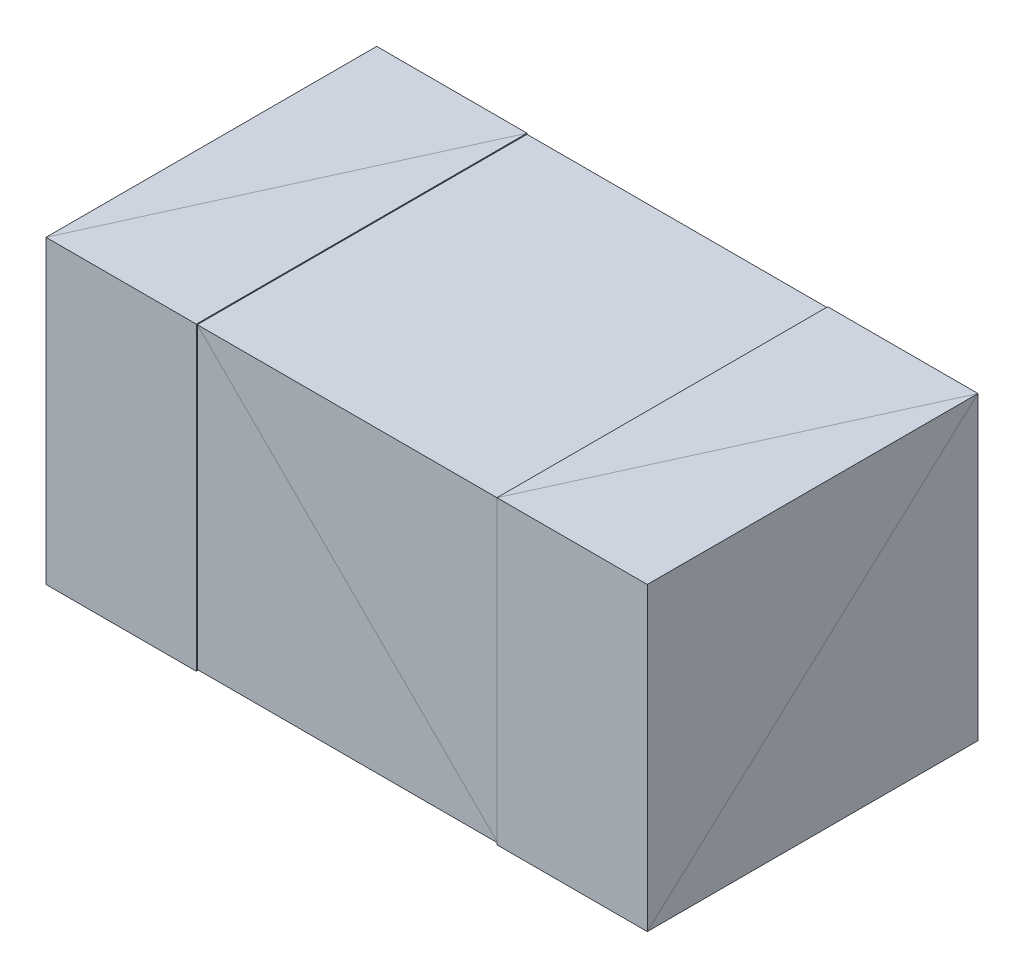
ISO-10303-21;
HEADER;
FILE_DESCRIPTION(('STEP AP214'),'2;1');
FILE_NAME('part.step','',(''),(''),'','','');
FILE_SCHEMA(('AUTOMOTIVE_DESIGN { 1 0 10303 214 1 1 1 1 }'));
ENDSEC;
DATA;
#1=APPLICATION_CONTEXT('core data for automotive mechanical design processes');
#2=APPLICATION_PROTOCOL_DEFINITION('international standard','automotive_design',2000,#1);
#3=PRODUCT_CONTEXT('',#1,'mechanical');
#4=PRODUCT('Part','Part','',(#3));
#5=PRODUCT_RELATED_PRODUCT_CATEGORY('part','',(#4));
#6=PRODUCT_DEFINITION_FORMATION('','',#4);
#7=PRODUCT_DEFINITION_CONTEXT('part definition',#1,'design');
#8=PRODUCT_DEFINITION('design','',#6,#7);
#9=PRODUCT_DEFINITION_SHAPE('','',#8);
#10=(LENGTH_UNIT() NAMED_UNIT(*) SI_UNIT(.MILLI.,.METRE.));
#11=(NAMED_UNIT(*) PLANE_ANGLE_UNIT() SI_UNIT($,.RADIAN.));
#12=(NAMED_UNIT(*) SI_UNIT($,.STERADIAN.) SOLID_ANGLE_UNIT());
#13=UNCERTAINTY_MEASURE_WITH_UNIT(LENGTH_MEASURE(1.E-05),#10,'distance_accuracy_value','');
#14=(GEOMETRIC_REPRESENTATION_CONTEXT(3) GLOBAL_UNCERTAINTY_ASSIGNED_CONTEXT((#13)) GLOBAL_UNIT_ASSIGNED_CONTEXT((#10,
#11,#12)) REPRESENTATION_CONTEXT('',''));
#15=CARTESIAN_POINT('',(0.,0.,0.));
#16=DIRECTION('',(0.,0.,1.));
#17=DIRECTION('',(1.,0.,0.));
#18=AXIS2_PLACEMENT_3D('',#15,#16,#17);
#19=CARTESIAN_POINT('',(0.,0.,0.33));
#20=DIRECTION('',(0.,0.,1.));
#21=DIRECTION('',(1.,0.,0.));
#22=AXIS2_PLACEMENT_3D('',#19,#20,#21);
#23=PLANE('',#22);
#24=DIRECTION('',(1.,0.,0.));
#25=VECTOR('',#24,1.);
#26=CARTESIAN_POINT('',(-0.3,-0.15,0.33));
#27=LINE('',#26,#25);
#28=CARTESIAN_POINT('',(-0.3,-0.15,0.33));
#29=VERTEX_POINT('',#28);
#30=CARTESIAN_POINT('',(-0.15,-0.15,0.33));
#31=VERTEX_POINT('',#30);
#32=EDGE_CURVE('P0_E11',#29,#31,#27,.T.);
#33=ORIENTED_EDGE('',*,*,#32,.T.);
#34=DIRECTION('',(0.,1.,0.));
#35=VECTOR('',#34,1.);
#36=CARTESIAN_POINT('',(-0.15,0.15,0.33));
#37=LINE('',#36,#35);
#38=CARTESIAN_POINT('',(-0.15,0.15,0.33));
#39=VERTEX_POINT('',#38);
#40=EDGE_CURVE('P0_E27',#31,#39,#37,.T.);
#41=ORIENTED_EDGE('',*,*,#40,.T.);
#42=DIRECTION('',(-1.,0.,0.));
#43=VECTOR('',#42,1.);
#44=CARTESIAN_POINT('',(-0.3,0.15,0.33));
#45=LINE('',#44,#43);
#46=CARTESIAN_POINT('',(-0.3,0.15,0.33));
#47=VERTEX_POINT('',#46);
#48=EDGE_CURVE('P0_E199',#39,#47,#45,.T.);
#49=ORIENTED_EDGE('',*,*,#48,.T.);
#50=DIRECTION('',(0.,-1.,0.));
#51=VECTOR('',#50,1.);
#52=CARTESIAN_POINT('',(-0.3,0.15,0.33));
#53=LINE('',#52,#51);
#54=EDGE_CURVE('P0_E196',#47,#29,#53,.T.);
#55=ORIENTED_EDGE('',*,*,#54,.T.);
#56=EDGE_LOOP('',(#33,#41,#49,#55));
#57=FACE_BOUND('',#56,.T.);
#58=ADVANCED_FACE('P0_F17',(#57),#23,.T.);
#59=CARTESIAN_POINT('',(-0.3,-0.15,0.33));
#60=DIRECTION('',(0.,1.,0.));
#61=DIRECTION('',(-1.,0.,0.));
#62=AXIS2_PLACEMENT_3D('',#59,#60,#61);
#63=PLANE('',#62);
#64=DIRECTION('',(1.,0.,0.));
#65=VECTOR('',#64,1.);
#66=CARTESIAN_POINT('',(-0.3,-0.15,0.));
#67=LINE('',#66,#65);
#68=CARTESIAN_POINT('',(-0.3,-0.15,0.));
#69=VERTEX_POINT('',#68);
#70=CARTESIAN_POINT('',(-0.15,-0.15,0.));
#71=VERTEX_POINT('',#70);
#72=EDGE_CURVE('P0_E192',#69,#71,#67,.T.);
#73=ORIENTED_EDGE('',*,*,#72,.T.);
#74=DIRECTION('',(0.,0.,-1.));
#75=VECTOR('',#74,1.);
#76=CARTESIAN_POINT('',(-0.15,-0.15,0.33));
#77=LINE('',#76,#75);
#78=EDGE_CURVE('P0_E150',#31,#71,#77,.T.);
#79=ORIENTED_EDGE('',*,*,#78,.F.);
#80=ORIENTED_EDGE('',*,*,#32,.F.);
#81=DIRECTION('',(0.,0.,-1.));
#82=VECTOR('',#81,1.);
#83=CARTESIAN_POINT('',(-0.3,-0.15,0.33));
#84=LINE('',#83,#82);
#85=EDGE_CURVE('P0_E190',#29,#69,#84,.T.);
#86=ORIENTED_EDGE('',*,*,#85,.T.);
#87=EDGE_LOOP('',(#73,#79,#80,#86));
#88=FACE_BOUND('',#87,.T.);
#89=ADVANCED_FACE('P0_F214',(#88),#63,.F.);
#90=CARTESIAN_POINT('',(-0.3,0.15,0.33));
#91=DIRECTION('',(0.,-1.,0.));
#92=DIRECTION('',(0.,0.,-1.));
#93=AXIS2_PLACEMENT_3D('',#90,#91,#92);
#94=PLANE('',#93);
#95=ORIENTED_EDGE('',*,*,#48,.F.);
#96=DIRECTION('',(0.,0.,-1.));
#97=VECTOR('',#96,1.);
#98=CARTESIAN_POINT('',(-0.15,0.15,0.33));
#99=LINE('',#98,#97);
#100=CARTESIAN_POINT('',(-0.15,0.15,0.));
#101=VERTEX_POINT('',#100);
#102=EDGE_CURVE('P0_E187',#39,#101,#99,.T.);
#103=ORIENTED_EDGE('',*,*,#102,.T.);
#104=DIRECTION('',(-1.,0.,0.));
#105=VECTOR('',#104,1.);
#106=CARTESIAN_POINT('',(-0.3,0.15,0.));
#107=LINE('',#106,#105);
#108=CARTESIAN_POINT('',(-0.3,0.15,0.));
#109=VERTEX_POINT('',#108);
#110=EDGE_CURVE('P0_E183',#101,#109,#107,.T.);
#111=ORIENTED_EDGE('',*,*,#110,.T.);
#112=DIRECTION('',(0.,0.,-1.));
#113=VECTOR('',#112,1.);
#114=CARTESIAN_POINT('',(-0.3,0.15,0.33));
#115=LINE('',#114,#113);
#116=EDGE_CURVE('P0_E163',#47,#109,#115,.T.);
#117=ORIENTED_EDGE('',*,*,#116,.F.);
#118=EDGE_LOOP('',(#95,#103,#111,#117));
#119=FACE_BOUND('',#118,.T.);
#120=ADVANCED_FACE('P0_F208',(#119),#94,.F.);
#121=CARTESIAN_POINT('',(0.3,0.15,0.33));
#122=DIRECTION('',(-1.,0.,0.));
#123=DIRECTION('',(0.,-1.,0.));
#124=AXIS2_PLACEMENT_3D('',#121,#122,#123);
#125=PLANE('',#124);
#126=DIRECTION('',(0.,1.,0.));
#127=VECTOR('',#126,1.);
#128=CARTESIAN_POINT('',(0.3,0.15,0.));
#129=LINE('',#128,#127);
#130=CARTESIAN_POINT('',(0.3,-0.15,0.));
#131=VERTEX_POINT('',#130);
#132=CARTESIAN_POINT('',(0.3,0.15,0.));
#133=VERTEX_POINT('',#132);
#134=EDGE_CURVE('P0_E178',#131,#133,#129,.T.);
#135=ORIENTED_EDGE('',*,*,#134,.T.);
#136=DIRECTION('',(0.,0.,-1.));
#137=VECTOR('',#136,1.);
#138=CARTESIAN_POINT('',(0.3,0.15,0.33));
#139=LINE('',#138,#137);
#140=CARTESIAN_POINT('',(0.3,0.15,0.33));
#141=VERTEX_POINT('',#140);
#142=EDGE_CURVE('P0_E170',#141,#133,#139,.T.);
#143=ORIENTED_EDGE('',*,*,#142,.F.);
#144=DIRECTION('',(0.,1.,0.));
#145=VECTOR('',#144,1.);
#146=CARTESIAN_POINT('',(0.3,0.15,0.33));
#147=LINE('',#146,#145);
#148=CARTESIAN_POINT('',(0.3,-0.15,0.33));
#149=VERTEX_POINT('',#148);
#150=EDGE_CURVE('P0_E166',#149,#141,#147,.T.);
#151=ORIENTED_EDGE('',*,*,#150,.F.);
#152=DIRECTION('',(0.,0.,-1.));
#153=VECTOR('',#152,1.);
#154=CARTESIAN_POINT('',(0.3,-0.15,0.33));
#155=LINE('',#154,#153);
#156=EDGE_CURVE('P0_E176',#149,#131,#155,.T.);
#157=ORIENTED_EDGE('',*,*,#156,.T.);
#158=EDGE_LOOP('',(#135,#143,#151,#157));
#159=FACE_BOUND('',#158,.T.);
#160=ADVANCED_FACE('P0_F250',(#159),#125,.F.);
#161=CARTESIAN_POINT('',(-0.3,0.15,0.33));
#162=DIRECTION('',(0.,-1.,0.));
#163=DIRECTION('',(0.,0.,-1.));
#164=AXIS2_PLACEMENT_3D('',#161,#162,#163);
#165=PLANE('',#164);
#166=DIRECTION('',(-1.,0.,0.));
#167=VECTOR('',#166,1.);
#168=CARTESIAN_POINT('',(-0.3,0.15,0.));
#169=LINE('',#168,#167);
#170=CARTESIAN_POINT('',(0.15,0.15,0.));
#171=VERTEX_POINT('',#170);
#172=EDGE_CURVE('P0_E173',#133,#171,#169,.T.);
#173=ORIENTED_EDGE('',*,*,#172,.T.);
#174=DIRECTION('',(0.,0.,-1.));
#175=VECTOR('',#174,1.);
#176=CARTESIAN_POINT('',(0.15,0.15,0.33));
#177=LINE('',#176,#175);
#178=CARTESIAN_POINT('',(0.15,0.15,0.33));
#179=VERTEX_POINT('',#178);
#180=EDGE_CURVE('P0_E127',#179,#171,#177,.T.);
#181=ORIENTED_EDGE('',*,*,#180,.F.);
#182=DIRECTION('',(-1.,0.,0.));
#183=VECTOR('',#182,1.);
#184=CARTESIAN_POINT('',(-0.3,0.15,0.33));
#185=LINE('',#184,#183);
#186=EDGE_CURVE('P0_E149',#141,#179,#185,.T.);
#187=ORIENTED_EDGE('',*,*,#186,.F.);
#188=ORIENTED_EDGE('',*,*,#142,.T.);
#189=EDGE_LOOP('',(#173,#181,#187,#188));
#190=FACE_BOUND('',#189,.T.);
#191=ADVANCED_FACE('P0_F228',(#190),#165,.F.);
#192=CARTESIAN_POINT('',(-0.3,0.15,0.33));
#193=DIRECTION('',(1.,0.,0.));
#194=DIRECTION('',(0.,0.,-1.));
#195=AXIS2_PLACEMENT_3D('',#192,#193,#194);
#196=PLANE('',#195);
#197=DIRECTION('',(0.,-1.,0.));
#198=VECTOR('',#197,1.);
#199=CARTESIAN_POINT('',(-0.3,0.15,0.));
#200=LINE('',#199,#198);
#201=EDGE_CURVE('P0_E167',#109,#69,#200,.T.);
#202=ORIENTED_EDGE('',*,*,#201,.T.);
#203=ORIENTED_EDGE('',*,*,#85,.F.);
#204=ORIENTED_EDGE('',*,*,#54,.F.);
#205=ORIENTED_EDGE('',*,*,#116,.T.);
#206=EDGE_LOOP('',(#202,#203,#204,#205));
#207=FACE_BOUND('',#206,.T.);
#208=ADVANCED_FACE('P0_F211',(#207),#196,.F.);
#209=CARTESIAN_POINT('',(-0.3,-0.15,0.33));
#210=DIRECTION('',(0.,1.,0.));
#211=DIRECTION('',(-1.,0.,0.));
#212=AXIS2_PLACEMENT_3D('',#209,#210,#211);
#213=PLANE('',#212);
#214=DIRECTION('',(1.,0.,0.));
#215=VECTOR('',#214,1.);
#216=CARTESIAN_POINT('',(-0.3,-0.15,0.33));
#217=LINE('',#216,#215);
#218=CARTESIAN_POINT('',(0.15,-0.15,0.33));
#219=VERTEX_POINT('',#218);
#220=EDGE_CURVE('P0_E157',#219,#149,#217,.T.);
#221=ORIENTED_EDGE('',*,*,#220,.F.);
#222=DIRECTION('',(0.,0.,-1.));
#223=VECTOR('',#222,1.);
#224=CARTESIAN_POINT('',(0.15,-0.15,0.33));
#225=LINE('',#224,#223);
#226=CARTESIAN_POINT('',(0.15,-0.15,0.));
#227=VERTEX_POINT('',#226);
#228=EDGE_CURVE('P0_E160',#219,#227,#225,.T.);
#229=ORIENTED_EDGE('',*,*,#228,.T.);
#230=DIRECTION('',(1.,0.,0.));
#231=VECTOR('',#230,1.);
#232=CARTESIAN_POINT('',(-0.3,-0.15,0.));
#233=LINE('',#232,#231);
#234=EDGE_CURVE('P0_E156',#227,#131,#233,.T.);
#235=ORIENTED_EDGE('',*,*,#234,.T.);
#236=ORIENTED_EDGE('',*,*,#156,.F.);
#237=EDGE_LOOP('',(#221,#229,#235,#236));
#238=FACE_BOUND('',#237,.T.);
#239=ADVANCED_FACE('P0_F258',(#238),#213,.F.);
#240=CARTESIAN_POINT('',(0.,0.,0.33));
#241=DIRECTION('',(0.,0.,1.));
#242=DIRECTION('',(1.,0.,0.));
#243=AXIS2_PLACEMENT_3D('',#240,#241,#242);
#244=PLANE('',#243);
#245=DIRECTION('',(0.,-1.,0.));
#246=VECTOR('',#245,1.);
#247=CARTESIAN_POINT('',(0.15,0.15,0.33));
#248=LINE('',#247,#246);
#249=EDGE_CURVE('P0_E153',#179,#219,#248,.T.);
#250=ORIENTED_EDGE('',*,*,#249,.T.);
#251=ORIENTED_EDGE('',*,*,#220,.T.);
#252=ORIENTED_EDGE('',*,*,#150,.T.);
#253=ORIENTED_EDGE('',*,*,#186,.T.);
#254=EDGE_LOOP('',(#250,#251,#252,#253));
#255=FACE_BOUND('',#254,.T.);
#256=ADVANCED_FACE('P0_F224',(#255),#244,.T.);
#257=CARTESIAN_POINT('',(0.,0.,0.));
#258=DIRECTION('',(0.,0.,1.));
#259=DIRECTION('',(1.,0.,0.));
#260=AXIS2_PLACEMENT_3D('',#257,#258,#259);
#261=PLANE('',#260);
#262=DIRECTION('',(1.,0.,0.));
#263=VECTOR('',#262,1.);
#264=CARTESIAN_POINT('',(0.15,-0.149,0.));
#265=LINE('',#264,#263);
#266=CARTESIAN_POINT('',(-0.15,-0.149,0.));
#267=VERTEX_POINT('',#266);
#268=CARTESIAN_POINT('',(0.15,-0.149,0.));
#269=VERTEX_POINT('',#268);
#270=EDGE_CURVE('P0_E115',#267,#269,#265,.T.);
#271=ORIENTED_EDGE('',*,*,#270,.F.);
#272=DIRECTION('',(0.,1.,0.));
#273=VECTOR('',#272,1.);
#274=CARTESIAN_POINT('',(-0.15,-0.149,0.));
#275=LINE('',#274,#273);
#276=EDGE_CURVE('P0_E136',#71,#267,#275,.T.);
#277=ORIENTED_EDGE('',*,*,#276,.F.);
#278=ORIENTED_EDGE('',*,*,#72,.F.);
#279=ORIENTED_EDGE('',*,*,#201,.F.);
#280=ORIENTED_EDGE('',*,*,#110,.F.);
#281=DIRECTION('',(0.,1.,0.));
#282=VECTOR('',#281,1.);
#283=CARTESIAN_POINT('',(-0.15,0.15,0.));
#284=LINE('',#283,#282);
#285=CARTESIAN_POINT('',(-0.15,0.149,0.));
#286=VERTEX_POINT('',#285);
#287=EDGE_CURVE('P0_E146',#286,#101,#284,.T.);
#288=ORIENTED_EDGE('',*,*,#287,.F.);
#289=DIRECTION('',(-1.,0.,0.));
#290=VECTOR('',#289,1.);
#291=CARTESIAN_POINT('',(0.15,0.149,0.));
#292=LINE('',#291,#290);
#293=CARTESIAN_POINT('',(0.15,0.149,0.));
#294=VERTEX_POINT('',#293);
#295=EDGE_CURVE('P0_E141',#294,#286,#292,.T.);
#296=ORIENTED_EDGE('',*,*,#295,.F.);
#297=DIRECTION('',(0.,-1.,0.));
#298=VECTOR('',#297,1.);
#299=CARTESIAN_POINT('',(0.15,0.15,0.));
#300=LINE('',#299,#298);
#301=EDGE_CURVE('P0_E122',#171,#294,#300,.T.);
#302=ORIENTED_EDGE('',*,*,#301,.F.);
#303=ORIENTED_EDGE('',*,*,#172,.F.);
#304=ORIENTED_EDGE('',*,*,#134,.F.);
#305=ORIENTED_EDGE('',*,*,#234,.F.);
#306=DIRECTION('',(0.,-1.,0.));
#307=VECTOR('',#306,1.);
#308=CARTESIAN_POINT('',(0.15,-0.149,0.));
#309=LINE('',#308,#307);
#310=EDGE_CURVE('P0_E123',#269,#227,#309,.T.);
#311=ORIENTED_EDGE('',*,*,#310,.F.);
#312=EDGE_LOOP('',(#271,#277,#278,#279,#280,#288,#296,#302,#303,#304,#305,#311));
#313=FACE_BOUND('',#312,.T.);
#314=ADVANCED_FACE('P0_F218',(#313),#261,.F.);
#315=CARTESIAN_POINT('',(-0.15,0.15,0.33));
#316=DIRECTION('',(-1.,0.,0.));
#317=DIRECTION('',(0.,0.,1.));
#318=AXIS2_PLACEMENT_3D('',#315,#316,#317);
#319=PLANE('',#318);
#320=ORIENTED_EDGE('',*,*,#287,.T.);
#321=ORIENTED_EDGE('',*,*,#102,.F.);
#322=ORIENTED_EDGE('',*,*,#40,.F.);
#323=ORIENTED_EDGE('',*,*,#78,.T.);
#324=ORIENTED_EDGE('',*,*,#276,.T.);
#325=DIRECTION('',(0.,0.,-1.));
#326=VECTOR('',#325,1.);
#327=CARTESIAN_POINT('',(-0.15,-0.149,0.33));
#328=LINE('',#327,#326);
#329=CARTESIAN_POINT('',(-0.15,-0.149,0.329));
#330=VERTEX_POINT('',#329);
#331=EDGE_CURVE('P0_E128',#330,#267,#328,.T.);
#332=ORIENTED_EDGE('',*,*,#331,.F.);
#333=DIRECTION('',(0.,1.,0.));
#334=VECTOR('',#333,1.);
#335=CARTESIAN_POINT('',(-0.15,-0.15,0.329));
#336=LINE('',#335,#334);
#337=CARTESIAN_POINT('',(-0.15,0.149,0.329));
#338=VERTEX_POINT('',#337);
#339=EDGE_CURVE('P0_E126',#330,#338,#336,.T.);
#340=ORIENTED_EDGE('',*,*,#339,.T.);
#341=DIRECTION('',(0.,0.,-1.));
#342=VECTOR('',#341,1.);
#343=CARTESIAN_POINT('',(-0.15,0.149,0.33));
#344=LINE('',#343,#342);
#345=EDGE_CURVE('P0_E137',#338,#286,#344,.T.);
#346=ORIENTED_EDGE('',*,*,#345,.T.);
#347=EDGE_LOOP('',(#320,#321,#322,#323,#324,#332,#340,#346));
#348=FACE_BOUND('',#347,.T.);
#349=ADVANCED_FACE('P0_F206',(#348),#319,.F.);
#350=CARTESIAN_POINT('',(0.15,0.149,0.33));
#351=DIRECTION('',(0.,-1.,0.));
#352=DIRECTION('',(1.,0.,0.));
#353=AXIS2_PLACEMENT_3D('',#350,#351,#352);
#354=PLANE('',#353);
#355=ORIENTED_EDGE('',*,*,#345,.F.);
#356=DIRECTION('',(-1.,0.,0.));
#357=VECTOR('',#356,1.);
#358=CARTESIAN_POINT('',(0.15,0.149,0.329));
#359=LINE('',#358,#357);
#360=CARTESIAN_POINT('',(0.15,0.149,0.329));
#361=VERTEX_POINT('',#360);
#362=EDGE_CURVE('P0_E101',#361,#338,#359,.T.);
#363=ORIENTED_EDGE('',*,*,#362,.F.);
#364=DIRECTION('',(0.,0.,-1.));
#365=VECTOR('',#364,1.);
#366=CARTESIAN_POINT('',(0.15,0.149,0.33));
#367=LINE('',#366,#365);
#368=EDGE_CURVE('P0_E112',#361,#294,#367,.T.);
#369=ORIENTED_EDGE('',*,*,#368,.T.);
#370=ORIENTED_EDGE('',*,*,#295,.T.);
#371=EDGE_LOOP('',(#355,#363,#369,#370));
#372=FACE_BOUND('',#371,.T.);
#373=ADVANCED_FACE('P0_F231',(#372),#354,.F.);
#374=CARTESIAN_POINT('',(0.15,0.15,0.33));
#375=DIRECTION('',(1.,0.,0.));
#376=DIRECTION('',(0.,0.,-1.));
#377=AXIS2_PLACEMENT_3D('',#374,#375,#376);
#378=PLANE('',#377);
#379=ORIENTED_EDGE('',*,*,#301,.T.);
#380=ORIENTED_EDGE('',*,*,#368,.F.);
#381=DIRECTION('',(0.,1.,0.));
#382=VECTOR('',#381,1.);
#383=CARTESIAN_POINT('',(0.15,-0.15,0.329));
#384=LINE('',#383,#382);
#385=CARTESIAN_POINT('',(0.15,-0.149,0.329));
#386=VERTEX_POINT('',#385);
#387=EDGE_CURVE('P0_E107',#386,#361,#384,.T.);
#388=ORIENTED_EDGE('',*,*,#387,.F.);
#389=DIRECTION('',(0.,0.,-1.));
#390=VECTOR('',#389,1.);
#391=CARTESIAN_POINT('',(0.15,-0.149,0.33));
#392=LINE('',#391,#390);
#393=EDGE_CURVE('P0_E111',#386,#269,#392,.T.);
#394=ORIENTED_EDGE('',*,*,#393,.T.);
#395=ORIENTED_EDGE('',*,*,#310,.T.);
#396=ORIENTED_EDGE('',*,*,#228,.F.);
#397=ORIENTED_EDGE('',*,*,#249,.F.);
#398=ORIENTED_EDGE('',*,*,#180,.T.);
#399=EDGE_LOOP('',(#379,#380,#388,#394,#395,#396,#397,#398));
#400=FACE_BOUND('',#399,.T.);
#401=ADVANCED_FACE('P0_F109',(#400),#378,.F.);
#402=CARTESIAN_POINT('',(0.15,-0.149,0.33));
#403=DIRECTION('',(0.,1.,0.));
#404=DIRECTION('',(0.,0.,1.));
#405=AXIS2_PLACEMENT_3D('',#402,#403,#404);
#406=PLANE('',#405);
#407=ORIENTED_EDGE('',*,*,#393,.F.);
#408=DIRECTION('',(-1.,0.,0.));
#409=VECTOR('',#408,1.);
#410=CARTESIAN_POINT('',(0.15,-0.149,0.329));
#411=LINE('',#410,#409);
#412=EDGE_CURVE('P0_E21',#386,#330,#411,.T.);
#413=ORIENTED_EDGE('',*,*,#412,.T.);
#414=ORIENTED_EDGE('',*,*,#331,.T.);
#415=ORIENTED_EDGE('',*,*,#270,.T.);
#416=EDGE_LOOP('',(#407,#413,#414,#415));
#417=FACE_BOUND('',#416,.T.);
#418=ADVANCED_FACE('P0_F119',(#417),#406,.F.);
#419=CARTESIAN_POINT('',(0.15,-0.15,0.329));
#420=DIRECTION('',(0.,0.,-1.));
#421=DIRECTION('',(-1.,0.,0.));
#422=AXIS2_PLACEMENT_3D('',#419,#420,#421);
#423=PLANE('',#422);
#424=ORIENTED_EDGE('',*,*,#387,.T.);
#425=ORIENTED_EDGE('',*,*,#362,.T.);
#426=ORIENTED_EDGE('',*,*,#339,.F.);
#427=ORIENTED_EDGE('',*,*,#412,.F.);
#428=EDGE_LOOP('',(#424,#425,#426,#427));
#429=FACE_BOUND('',#428,.T.);
#430=ADVANCED_FACE('P0_F19',(#429),#423,.F.);
#431=CLOSED_SHELL('',(#58,#89,#120,#160,#191,#208,#239,#256,#314,#349,#373,#401,#418,#430));
#432=MANIFOLD_SOLID_BREP('P0_B1',#431);
#433=CARTESIAN_POINT('',(0.,0.,0.33));
#434=DIRECTION('',(0.,0.,1.));
#435=DIRECTION('',(1.,0.,0.));
#436=AXIS2_PLACEMENT_3D('',#433,#434,#435);
#437=PLANE('',#436);
#438=DIRECTION('',(1.,0.,0.));
#439=VECTOR('',#438,1.);
#440=CARTESIAN_POINT('',(-0.3,0.15,0.33));
#441=LINE('',#440,#439);
#442=CARTESIAN_POINT('',(-0.3,0.15,0.33));
#443=VERTEX_POINT('',#442);
#444=CARTESIAN_POINT('',(-0.15,0.15,0.33));
#445=VERTEX_POINT('',#444);
#446=EDGE_CURVE('P1_E114',#443,#445,#441,.T.);
#447=ORIENTED_EDGE('',*,*,#446,.F.);
#448=DIRECTION('',(0.,1.,0.));
#449=VECTOR('',#448,1.);
#450=CARTESIAN_POINT('',(-0.3,0.15,0.33));
#451=LINE('',#450,#449);
#452=CARTESIAN_POINT('',(-0.3,-0.15,0.33));
#453=VERTEX_POINT('',#452);
#454=EDGE_CURVE('P1_E125',#453,#443,#451,.T.);
#455=ORIENTED_EDGE('',*,*,#454,.F.);
#456=DIRECTION('',(1.,0.,0.));
#457=VECTOR('',#456,1.);
#458=CARTESIAN_POINT('',(-0.3,-0.15,0.33));
#459=LINE('',#458,#457);
#460=CARTESIAN_POINT('',(-0.15,-0.15,0.33));
#461=VERTEX_POINT('',#460);
#462=EDGE_CURVE('P1_E115',#461,#453,#459,.F.);
#463=ORIENTED_EDGE('',*,*,#462,.F.);
#464=DIRECTION('',(0.,1.,0.));
#465=VECTOR('',#464,1.);
#466=CARTESIAN_POINT('',(-0.15,0.15,0.33));
#467=LINE('',#466,#465);
#468=EDGE_CURVE('P1_E111',#445,#461,#467,.F.);
#469=ORIENTED_EDGE('',*,*,#468,.F.);
#470=EDGE_LOOP('',(#447,#455,#463,#469));
#471=FACE_BOUND('',#470,.T.);
#472=ADVANCED_FACE('P1_F16',(#471),#437,.T.);
#473=CARTESIAN_POINT('',(-0.15,0.15,0.33));
#474=DIRECTION('',(1.,0.,0.));
#475=DIRECTION('',(0.,0.,-1.));
#476=AXIS2_PLACEMENT_3D('',#473,#474,#475);
#477=PLANE('',#476);
#478=DIRECTION('',(0.,1.,0.));
#479=VECTOR('',#478,1.);
#480=CARTESIAN_POINT('',(-0.15,-0.15,0.329));
#481=LINE('',#480,#479);
#482=CARTESIAN_POINT('',(-0.15,0.149,0.329));
#483=VERTEX_POINT('',#482);
#484=CARTESIAN_POINT('',(-0.15,-0.149,0.329));
#485=VERTEX_POINT('',#484);
#486=EDGE_CURVE('P1_E151',#483,#485,#481,.F.);
#487=ORIENTED_EDGE('',*,*,#486,.F.);
#488=DIRECTION('',(0.,0.,1.));
#489=VECTOR('',#488,1.);
#490=CARTESIAN_POINT('',(-0.15,0.149,0.33));
#491=LINE('',#490,#489);
#492=CARTESIAN_POINT('',(-0.15,0.149,0.));
#493=VERTEX_POINT('',#492);
#494=EDGE_CURVE('P1_E167',#493,#483,#491,.T.);
#495=ORIENTED_EDGE('',*,*,#494,.F.);
#496=DIRECTION('',(0.,1.,0.));
#497=VECTOR('',#496,1.);
#498=CARTESIAN_POINT('',(-0.15,0.15,0.));
#499=LINE('',#498,#497);
#500=CARTESIAN_POINT('',(-0.15,0.15,0.));
#501=VERTEX_POINT('',#500);
#502=EDGE_CURVE('P1_E19',#493,#501,#499,.T.);
#503=ORIENTED_EDGE('',*,*,#502,.T.);
#504=DIRECTION('',(0.,0.,1.));
#505=VECTOR('',#504,1.);
#506=CARTESIAN_POINT('',(-0.15,0.15,0.33));
#507=LINE('',#506,#505);
#508=EDGE_CURVE('P1_E120',#445,#501,#507,.F.);
#509=ORIENTED_EDGE('',*,*,#508,.F.);
#510=ORIENTED_EDGE('',*,*,#468,.T.);
#511=DIRECTION('',(0.,0.,-1.));
#512=VECTOR('',#511,1.);
#513=CARTESIAN_POINT('',(-0.15,-0.15,0.33));
#514=LINE('',#513,#512);
#515=CARTESIAN_POINT('',(-0.15,-0.15,0.));
#516=VERTEX_POINT('',#515);
#517=EDGE_CURVE('P1_E137',#516,#461,#514,.F.);
#518=ORIENTED_EDGE('',*,*,#517,.F.);
#519=DIRECTION('',(0.,1.,0.));
#520=VECTOR('',#519,1.);
#521=CARTESIAN_POINT('',(-0.15,0.15,0.));
#522=LINE('',#521,#520);
#523=CARTESIAN_POINT('',(-0.15,-0.149,0.));
#524=VERTEX_POINT('',#523);
#525=EDGE_CURVE('P1_E118',#516,#524,#522,.T.);
#526=ORIENTED_EDGE('',*,*,#525,.T.);
#527=DIRECTION('',(0.,0.,-1.));
#528=VECTOR('',#527,1.);
#529=CARTESIAN_POINT('',(-0.15,-0.149,0.33));
#530=LINE('',#529,#528);
#531=EDGE_CURVE('P1_E143',#485,#524,#530,.T.);
#532=ORIENTED_EDGE('',*,*,#531,.F.);
#533=EDGE_LOOP('',(#487,#495,#503,#509,#510,#518,#526,#532));
#534=FACE_BOUND('',#533,.T.);
#535=ADVANCED_FACE('P1_F121',(#534),#477,.T.);
#536=CARTESIAN_POINT('',(0.15,-0.15,0.329));
#537=DIRECTION('',(0.,0.,1.));
#538=DIRECTION('',(1.,0.,0.));
#539=AXIS2_PLACEMENT_3D('',#536,#537,#538);
#540=PLANE('',#539);
#541=ORIENTED_EDGE('',*,*,#486,.T.);
#542=DIRECTION('',(1.,0.,0.));
#543=VECTOR('',#542,1.);
#544=CARTESIAN_POINT('',(0.15,-0.149,0.329));
#545=LINE('',#544,#543);
#546=CARTESIAN_POINT('',(0.15,-0.149,0.329));
#547=VERTEX_POINT('',#546);
#548=EDGE_CURVE('P1_E140',#547,#485,#545,.F.);
#549=ORIENTED_EDGE('',*,*,#548,.F.);
#550=DIRECTION('',(0.,1.,0.));
#551=VECTOR('',#550,1.);
#552=CARTESIAN_POINT('',(0.15,0.15,0.329));
#553=LINE('',#552,#551);
#554=CARTESIAN_POINT('',(0.15,0.149,0.329));
#555=VERTEX_POINT('',#554);
#556=EDGE_CURVE('P1_E149',#555,#547,#553,.F.);
#557=ORIENTED_EDGE('',*,*,#556,.F.);
#558=DIRECTION('',(-1.,0.,0.));
#559=VECTOR('',#558,1.);
#560=CARTESIAN_POINT('',(0.15,0.149,0.329));
#561=LINE('',#560,#559);
#562=EDGE_CURVE('P1_E163',#483,#555,#561,.F.);
#563=ORIENTED_EDGE('',*,*,#562,.F.);
#564=EDGE_LOOP('',(#541,#549,#557,#563));
#565=FACE_BOUND('',#564,.T.);
#566=ADVANCED_FACE('P1_F284',(#565),#540,.T.);
#567=CARTESIAN_POINT('',(0.,0.,0.33));
#568=DIRECTION('',(0.,0.,1.));
#569=DIRECTION('',(1.,0.,0.));
#570=AXIS2_PLACEMENT_3D('',#567,#568,#569);
#571=PLANE('',#570);
#572=DIRECTION('',(0.,1.,0.));
#573=VECTOR('',#572,1.);
#574=CARTESIAN_POINT('',(0.3,0.15,0.33));
#575=LINE('',#574,#573);
#576=CARTESIAN_POINT('',(0.3,0.15,0.33));
#577=VERTEX_POINT('',#576);
#578=CARTESIAN_POINT('',(0.3,-0.15,0.33));
#579=VERTEX_POINT('',#578);
#580=EDGE_CURVE('P1_E187',#577,#579,#575,.F.);
#581=ORIENTED_EDGE('',*,*,#580,.F.);
#582=DIRECTION('',(1.,0.,0.));
#583=VECTOR('',#582,1.);
#584=CARTESIAN_POINT('',(-0.3,0.15,0.33));
#585=LINE('',#584,#583);
#586=CARTESIAN_POINT('',(0.15,0.15,0.33));
#587=VERTEX_POINT('',#586);
#588=EDGE_CURVE('P1_E173',#587,#577,#585,.T.);
#589=ORIENTED_EDGE('',*,*,#588,.F.);
#590=DIRECTION('',(0.,1.,0.));
#591=VECTOR('',#590,1.);
#592=CARTESIAN_POINT('',(0.15,0.15,0.33));
#593=LINE('',#592,#591);
#594=CARTESIAN_POINT('',(0.15,-0.15,0.33));
#595=VERTEX_POINT('',#594);
#596=EDGE_CURVE('P1_E148',#595,#587,#593,.T.);
#597=ORIENTED_EDGE('',*,*,#596,.F.);
#598=DIRECTION('',(1.,0.,0.));
#599=VECTOR('',#598,1.);
#600=CARTESIAN_POINT('',(-0.3,-0.15,0.33));
#601=LINE('',#600,#599);
#602=EDGE_CURVE('P1_E183',#579,#595,#601,.F.);
#603=ORIENTED_EDGE('',*,*,#602,.F.);
#604=EDGE_LOOP('',(#581,#589,#597,#603));
#605=FACE_BOUND('',#604,.T.);
#606=ADVANCED_FACE('P1_F289',(#605),#571,.T.);
#607=CARTESIAN_POINT('',(0.15,0.15,0.33));
#608=DIRECTION('',(-1.,0.,0.));
#609=DIRECTION('',(0.,0.,1.));
#610=AXIS2_PLACEMENT_3D('',#607,#608,#609);
#611=PLANE('',#610);
#612=ORIENTED_EDGE('',*,*,#596,.T.);
#613=DIRECTION('',(0.,0.,1.));
#614=VECTOR('',#613,1.);
#615=CARTESIAN_POINT('',(0.15,0.15,0.33));
#616=LINE('',#615,#614);
#617=CARTESIAN_POINT('',(0.15,0.15,0.));
#618=VERTEX_POINT('',#617);
#619=EDGE_CURVE('P1_E177',#618,#587,#616,.T.);
#620=ORIENTED_EDGE('',*,*,#619,.F.);
#621=DIRECTION('',(0.,1.,0.));
#622=VECTOR('',#621,1.);
#623=CARTESIAN_POINT('',(0.15,0.15,0.));
#624=LINE('',#623,#622);
#625=CARTESIAN_POINT('',(0.15,0.149,0.));
#626=VERTEX_POINT('',#625);
#627=EDGE_CURVE('P1_E150',#618,#626,#624,.F.);
#628=ORIENTED_EDGE('',*,*,#627,.T.);
#629=DIRECTION('',(0.,0.,1.));
#630=VECTOR('',#629,1.);
#631=CARTESIAN_POINT('',(0.15,0.149,0.33));
#632=LINE('',#631,#630);
#633=EDGE_CURVE('P1_E166',#555,#626,#632,.F.);
#634=ORIENTED_EDGE('',*,*,#633,.F.);
#635=ORIENTED_EDGE('',*,*,#556,.T.);
#636=DIRECTION('',(0.,0.,-1.));
#637=VECTOR('',#636,1.);
#638=CARTESIAN_POINT('',(0.15,-0.149,0.33));
#639=LINE('',#638,#637);
#640=CARTESIAN_POINT('',(0.15,-0.149,0.));
#641=VERTEX_POINT('',#640);
#642=EDGE_CURVE('P1_E144',#641,#547,#639,.F.);
#643=ORIENTED_EDGE('',*,*,#642,.F.);
#644=DIRECTION('',(0.,1.,0.));
#645=VECTOR('',#644,1.);
#646=CARTESIAN_POINT('',(0.15,0.15,0.));
#647=LINE('',#646,#645);
#648=CARTESIAN_POINT('',(0.15,-0.15,0.));
#649=VERTEX_POINT('',#648);
#650=EDGE_CURVE('P1_E34',#641,#649,#647,.F.);
#651=ORIENTED_EDGE('',*,*,#650,.T.);
#652=DIRECTION('',(0.,0.,-1.));
#653=VECTOR('',#652,1.);
#654=CARTESIAN_POINT('',(0.15,-0.15,0.33));
#655=LINE('',#654,#653);
#656=EDGE_CURVE('P1_E186',#595,#649,#655,.T.);
#657=ORIENTED_EDGE('',*,*,#656,.F.);
#658=EDGE_LOOP('',(#612,#620,#628,#634,#635,#643,#651,#657));
#659=FACE_BOUND('',#658,.T.);
#660=ADVANCED_FACE('P1_F279',(#659),#611,.T.);
#661=CARTESIAN_POINT('',(0.15,-0.149,0.33));
#662=DIRECTION('',(0.,-1.,0.));
#663=DIRECTION('',(0.,0.,-1.));
#664=AXIS2_PLACEMENT_3D('',#661,#662,#663);
#665=PLANE('',#664);
#666=ORIENTED_EDGE('',*,*,#531,.T.);
#667=DIRECTION('',(-1.,0.,0.));
#668=VECTOR('',#667,1.);
#669=CARTESIAN_POINT('',(0.,-0.149,0.));
#670=LINE('',#669,#668);
#671=EDGE_CURVE('P1_E244',#641,#524,#670,.T.);
#672=ORIENTED_EDGE('',*,*,#671,.F.);
#673=ORIENTED_EDGE('',*,*,#642,.T.);
#674=ORIENTED_EDGE('',*,*,#548,.T.);
#675=EDGE_LOOP('',(#666,#672,#673,#674));
#676=FACE_BOUND('',#675,.T.);
#677=ADVANCED_FACE('P1_F282',(#676),#665,.T.);
#678=CARTESIAN_POINT('',(-0.3,-0.15,0.33));
#679=DIRECTION('',(0.,-1.,0.));
#680=DIRECTION('',(0.,0.,-1.));
#681=AXIS2_PLACEMENT_3D('',#678,#679,#680);
#682=PLANE('',#681);
#683=ORIENTED_EDGE('',*,*,#462,.T.);
#684=DIRECTION('',(0.,0.,1.));
#685=VECTOR('',#684,1.);
#686=CARTESIAN_POINT('',(-0.3,-0.15,0.33));
#687=LINE('',#686,#685);
#688=CARTESIAN_POINT('',(-0.3,-0.15,0.));
#689=VERTEX_POINT('',#688);
#690=EDGE_CURVE('P1_E127',#689,#453,#687,.T.);
#691=ORIENTED_EDGE('',*,*,#690,.F.);
#692=DIRECTION('',(-1.,0.,0.));
#693=VECTOR('',#692,1.);
#694=CARTESIAN_POINT('',(0.,-0.15,0.));
#695=LINE('',#694,#693);
#696=EDGE_CURVE('P1_E212',#516,#689,#695,.T.);
#697=ORIENTED_EDGE('',*,*,#696,.F.);
#698=ORIENTED_EDGE('',*,*,#517,.T.);
#699=EDGE_LOOP('',(#683,#691,#697,#698));
#700=FACE_BOUND('',#699,.T.);
#701=ADVANCED_FACE('P1_F318',(#700),#682,.T.);
#702=CARTESIAN_POINT('',(-0.3,0.15,0.33));
#703=DIRECTION('',(-1.,0.,0.));
#704=DIRECTION('',(0.,0.,1.));
#705=AXIS2_PLACEMENT_3D('',#702,#703,#704);
#706=PLANE('',#705);
#707=ORIENTED_EDGE('',*,*,#454,.T.);
#708=DIRECTION('',(0.,0.,1.));
#709=VECTOR('',#708,1.);
#710=CARTESIAN_POINT('',(-0.3,0.15,0.33));
#711=LINE('',#710,#709);
#712=CARTESIAN_POINT('',(-0.3,0.15,0.));
#713=VERTEX_POINT('',#712);
#714=EDGE_CURVE('P1_E72',#713,#443,#711,.T.);
#715=ORIENTED_EDGE('',*,*,#714,.F.);
#716=DIRECTION('',(0.,1.,0.));
#717=VECTOR('',#716,1.);
#718=CARTESIAN_POINT('',(-0.3,0.,0.));
#719=LINE('',#718,#717);
#720=EDGE_CURVE('P1_E208',#689,#713,#719,.T.);
#721=ORIENTED_EDGE('',*,*,#720,.F.);
#722=ORIENTED_EDGE('',*,*,#690,.T.);
#723=EDGE_LOOP('',(#707,#715,#721,#722));
#724=FACE_BOUND('',#723,.T.);
#725=ADVANCED_FACE('P1_F315',(#724),#706,.T.);
#726=CARTESIAN_POINT('',(-0.3,0.15,0.33));
#727=DIRECTION('',(0.,1.,0.));
#728=DIRECTION('',(0.,0.,1.));
#729=AXIS2_PLACEMENT_3D('',#726,#727,#728);
#730=PLANE('',#729);
#731=DIRECTION('',(-1.,0.,0.));
#732=VECTOR('',#731,1.);
#733=CARTESIAN_POINT('',(0.,0.15,0.));
#734=LINE('',#733,#732);
#735=EDGE_CURVE('P1_E211',#713,#501,#734,.F.);
#736=ORIENTED_EDGE('',*,*,#735,.F.);
#737=ORIENTED_EDGE('',*,*,#714,.T.);
#738=ORIENTED_EDGE('',*,*,#446,.T.);
#739=ORIENTED_EDGE('',*,*,#508,.T.);
#740=EDGE_LOOP('',(#736,#737,#738,#739));
#741=FACE_BOUND('',#740,.T.);
#742=ADVANCED_FACE('P1_F124',(#741),#730,.T.);
#743=CARTESIAN_POINT('',(0.15,0.149,0.33));
#744=DIRECTION('',(0.,1.,0.));
#745=DIRECTION('',(-1.,0.,0.));
#746=AXIS2_PLACEMENT_3D('',#743,#744,#745);
#747=PLANE('',#746);
#748=ORIENTED_EDGE('',*,*,#633,.T.);
#749=DIRECTION('',(-1.,0.,0.));
#750=VECTOR('',#749,1.);
#751=CARTESIAN_POINT('',(0.,0.149,0.));
#752=LINE('',#751,#750);
#753=EDGE_CURVE('P1_E257',#493,#626,#752,.F.);
#754=ORIENTED_EDGE('',*,*,#753,.F.);
#755=ORIENTED_EDGE('',*,*,#494,.T.);
#756=ORIENTED_EDGE('',*,*,#562,.T.);
#757=EDGE_LOOP('',(#748,#754,#755,#756));
#758=FACE_BOUND('',#757,.T.);
#759=ADVANCED_FACE('P1_F286',(#758),#747,.T.);
#760=CARTESIAN_POINT('',(-0.3,0.15,0.33));
#761=DIRECTION('',(0.,1.,0.));
#762=DIRECTION('',(0.,0.,1.));
#763=AXIS2_PLACEMENT_3D('',#760,#761,#762);
#764=PLANE('',#763);
#765=ORIENTED_EDGE('',*,*,#588,.T.);
#766=DIRECTION('',(0.,0.,1.));
#767=VECTOR('',#766,1.);
#768=CARTESIAN_POINT('',(0.3,0.15,0.33));
#769=LINE('',#768,#767);
#770=CARTESIAN_POINT('',(0.3,0.15,0.));
#771=VERTEX_POINT('',#770);
#772=EDGE_CURVE('P1_E176',#771,#577,#769,.T.);
#773=ORIENTED_EDGE('',*,*,#772,.F.);
#774=DIRECTION('',(-1.,0.,0.));
#775=VECTOR('',#774,1.);
#776=CARTESIAN_POINT('',(0.,0.15,0.));
#777=LINE('',#776,#775);
#778=EDGE_CURVE('P1_E238',#618,#771,#777,.F.);
#779=ORIENTED_EDGE('',*,*,#778,.F.);
#780=ORIENTED_EDGE('',*,*,#619,.T.);
#781=EDGE_LOOP('',(#765,#773,#779,#780));
#782=FACE_BOUND('',#781,.T.);
#783=ADVANCED_FACE('P1_F270',(#782),#764,.T.);
#784=CARTESIAN_POINT('',(0.3,0.15,0.33));
#785=DIRECTION('',(1.,0.,0.));
#786=DIRECTION('',(0.,1.,0.));
#787=AXIS2_PLACEMENT_3D('',#784,#785,#786);
#788=PLANE('',#787);
#789=ORIENTED_EDGE('',*,*,#580,.T.);
#790=DIRECTION('',(0.,0.,-1.));
#791=VECTOR('',#790,1.);
#792=CARTESIAN_POINT('',(0.3,-0.15,0.33));
#793=LINE('',#792,#791);
#794=CARTESIAN_POINT('',(0.3,-0.15,0.));
#795=VERTEX_POINT('',#794);
#796=EDGE_CURVE('P1_E241',#795,#579,#793,.F.);
#797=ORIENTED_EDGE('',*,*,#796,.F.);
#798=DIRECTION('',(0.,1.,0.));
#799=VECTOR('',#798,1.);
#800=CARTESIAN_POINT('',(0.3,0.,0.));
#801=LINE('',#800,#799);
#802=EDGE_CURVE('P1_E25',#771,#795,#801,.F.);
#803=ORIENTED_EDGE('',*,*,#802,.F.);
#804=ORIENTED_EDGE('',*,*,#772,.T.);
#805=EDGE_LOOP('',(#789,#797,#803,#804));
#806=FACE_BOUND('',#805,.T.);
#807=ADVANCED_FACE('P1_F274',(#806),#788,.T.);
#808=CARTESIAN_POINT('',(-0.3,-0.15,0.33));
#809=DIRECTION('',(0.,-1.,0.));
#810=DIRECTION('',(0.,0.,-1.));
#811=AXIS2_PLACEMENT_3D('',#808,#809,#810);
#812=PLANE('',#811);
#813=DIRECTION('',(-1.,0.,0.));
#814=VECTOR('',#813,1.);
#815=CARTESIAN_POINT('',(0.,-0.15,0.));
#816=LINE('',#815,#814);
#817=EDGE_CURVE('P1_E10',#795,#649,#816,.T.);
#818=ORIENTED_EDGE('',*,*,#817,.F.);
#819=ORIENTED_EDGE('',*,*,#796,.T.);
#820=ORIENTED_EDGE('',*,*,#602,.T.);
#821=ORIENTED_EDGE('',*,*,#656,.T.);
#822=EDGE_LOOP('',(#818,#819,#820,#821));
#823=FACE_BOUND('',#822,.T.);
#824=ADVANCED_FACE('P1_F277',(#823),#812,.T.);
#825=CARTESIAN_POINT('',(0.,0.,0.));
#826=DIRECTION('',(0.,0.,-1.));
#827=DIRECTION('',(-1.,0.,0.));
#828=AXIS2_PLACEMENT_3D('',#825,#826,#827);
#829=PLANE('',#828);
#830=ORIENTED_EDGE('',*,*,#817,.T.);
#831=ORIENTED_EDGE('',*,*,#650,.F.);
#832=ORIENTED_EDGE('',*,*,#671,.T.);
#833=ORIENTED_EDGE('',*,*,#525,.F.);
#834=ORIENTED_EDGE('',*,*,#696,.T.);
#835=ORIENTED_EDGE('',*,*,#720,.T.);
#836=ORIENTED_EDGE('',*,*,#735,.T.);
#837=ORIENTED_EDGE('',*,*,#502,.F.);
#838=ORIENTED_EDGE('',*,*,#753,.T.);
#839=ORIENTED_EDGE('',*,*,#627,.F.);
#840=ORIENTED_EDGE('',*,*,#778,.T.);
#841=ORIENTED_EDGE('',*,*,#802,.T.);
#842=EDGE_LOOP('',(#830,#831,#832,#833,#834,#835,#836,#837,#838,#839,#840,#841));
#843=FACE_BOUND('',#842,.T.);
#844=ADVANCED_FACE('P1_F265',(#843),#829,.T.);
#845=CLOSED_SHELL('',(#472,#535,#566,#606,#660,#677,#701,#725,#742,#759,#783,#807,#824,#844));
#846=MANIFOLD_SOLID_BREP('P1_B1',#845);
#847=ADVANCED_BREP_SHAPE_REPRESENTATION('',(#18,#432,#846),#14);
#848=SHAPE_DEFINITION_REPRESENTATION(#9,#847);
ENDSEC;
END-ISO-10303-21;
